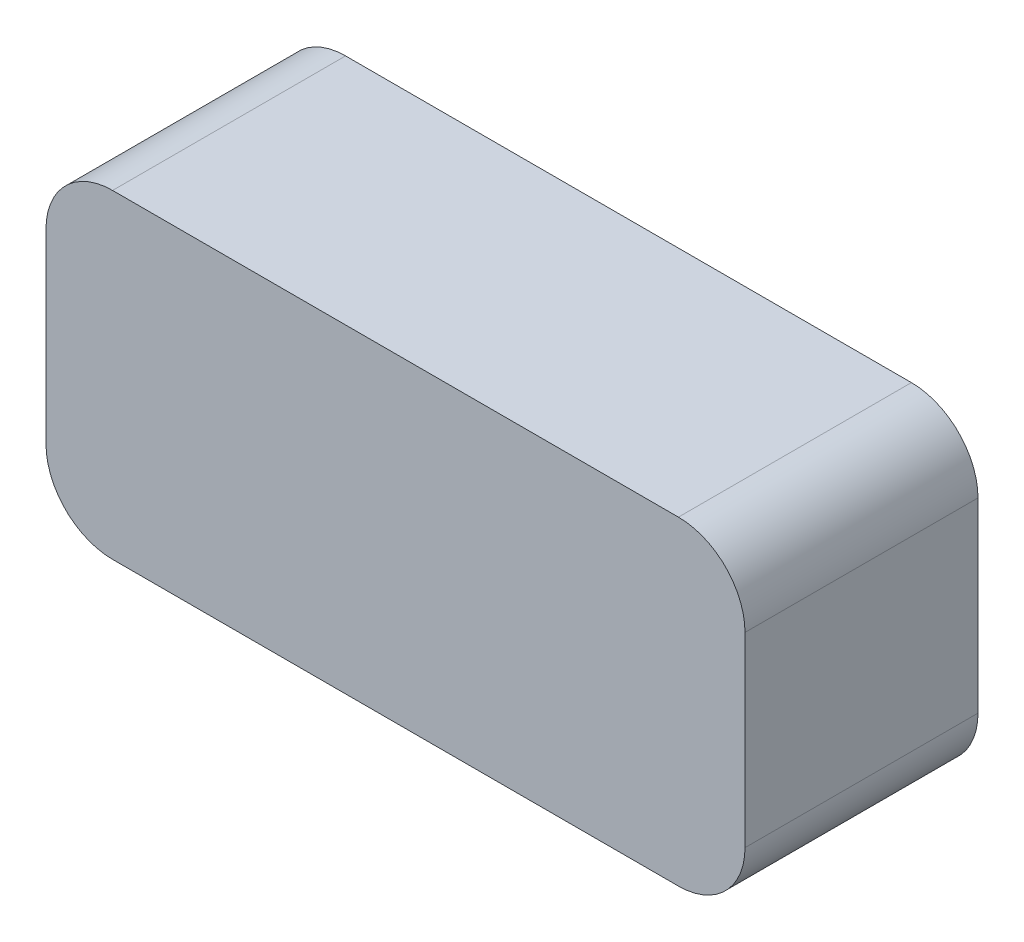
ISO-10303-21;
HEADER;
FILE_DESCRIPTION(('STEP AP214'),'2;1');
FILE_NAME('part.step','',(''),(''),'','','');
FILE_SCHEMA(('AUTOMOTIVE_DESIGN { 1 0 10303 214 1 1 1 1 }'));
ENDSEC;
DATA;
#1=APPLICATION_CONTEXT('core data for automotive mechanical design processes');
#2=APPLICATION_PROTOCOL_DEFINITION('international standard','automotive_design',2000,#1);
#3=PRODUCT_CONTEXT('',#1,'mechanical');
#4=PRODUCT('Part','Part','',(#3));
#5=PRODUCT_RELATED_PRODUCT_CATEGORY('part','',(#4));
#6=PRODUCT_DEFINITION_FORMATION('','',#4);
#7=PRODUCT_DEFINITION_CONTEXT('part definition',#1,'design');
#8=PRODUCT_DEFINITION('design','',#6,#7);
#9=PRODUCT_DEFINITION_SHAPE('','',#8);
#10=(LENGTH_UNIT() NAMED_UNIT(*) SI_UNIT(.MILLI.,.METRE.));
#11=(NAMED_UNIT(*) PLANE_ANGLE_UNIT() SI_UNIT($,.RADIAN.));
#12=(NAMED_UNIT(*) SI_UNIT($,.STERADIAN.) SOLID_ANGLE_UNIT());
#13=UNCERTAINTY_MEASURE_WITH_UNIT(LENGTH_MEASURE(1.E-05),#10,'distance_accuracy_value','');
#14=(GEOMETRIC_REPRESENTATION_CONTEXT(3) GLOBAL_UNCERTAINTY_ASSIGNED_CONTEXT((#13)) GLOBAL_UNIT_ASSIGNED_CONTEXT((#10,
#11,#12)) REPRESENTATION_CONTEXT('',''));
#15=CARTESIAN_POINT('',(0.,0.,0.));
#16=DIRECTION('',(0.,0.,1.));
#17=DIRECTION('',(1.,0.,0.));
#18=AXIS2_PLACEMENT_3D('',#15,#16,#17);
#19=CARTESIAN_POINT('',(-8.5,-3.,7.));
#20=DIRECTION('',(0.,0.,-1.));
#21=DIRECTION('',(-1.,0.,0.));
#22=AXIS2_PLACEMENT_3D('',#19,#20,#21);
#23=CYLINDRICAL_SURFACE('',#22,2.);
#24=CARTESIAN_POINT('',(-8.5,-3.,0.));
#25=DIRECTION('',(0.,0.,1.));
#26=DIRECTION('',(1.,0.,0.));
#27=AXIS2_PLACEMENT_3D('',#24,#25,#26);
#28=CIRCLE('',#27,2.);
#29=CARTESIAN_POINT('',(-10.5,-3.,0.));
#30=VERTEX_POINT('',#29);
#31=CARTESIAN_POINT('',(-8.5,-5.,0.));
#32=VERTEX_POINT('',#31);
#33=EDGE_CURVE('E133',#30,#32,#28,.T.);
#34=ORIENTED_EDGE('',*,*,#33,.T.);
#35=DIRECTION('',(0.,0.,-1.));
#36=VECTOR('',#35,1.);
#37=CARTESIAN_POINT('',(-8.5,-5.,7.));
#38=LINE('',#37,#36);
#39=CARTESIAN_POINT('',(-8.5,-5.,7.));
#40=VERTEX_POINT('',#39);
#41=EDGE_CURVE('E11',#40,#32,#38,.T.);
#42=ORIENTED_EDGE('',*,*,#41,.F.);
#43=CARTESIAN_POINT('',(-8.5,-3.,7.));
#44=DIRECTION('',(0.,0.,1.));
#45=DIRECTION('',(1.,0.,0.));
#46=AXIS2_PLACEMENT_3D('',#43,#44,#45);
#47=CIRCLE('',#46,2.);
#48=CARTESIAN_POINT('',(-10.5,-3.,7.));
#49=VERTEX_POINT('',#48);
#50=EDGE_CURVE('E149',#49,#40,#47,.T.);
#51=ORIENTED_EDGE('',*,*,#50,.F.);
#52=DIRECTION('',(0.,0.,-1.));
#53=VECTOR('',#52,1.);
#54=CARTESIAN_POINT('',(-10.5,-3.,7.));
#55=LINE('',#54,#53);
#56=EDGE_CURVE('E132',#49,#30,#55,.T.);
#57=ORIENTED_EDGE('',*,*,#56,.T.);
#58=EDGE_LOOP('',(#34,#42,#51,#57));
#59=FACE_BOUND('',#58,.T.);
#60=ADVANCED_FACE('F39',(#59),#23,.T.);
#61=CARTESIAN_POINT('',(-8.5,-5.,7.));
#62=DIRECTION('',(0.,1.,0.));
#63=DIRECTION('',(0.,0.,1.));
#64=AXIS2_PLACEMENT_3D('',#61,#62,#63);
#65=PLANE('',#64);
#66=DIRECTION('',(1.,0.,0.));
#67=VECTOR('',#66,1.);
#68=CARTESIAN_POINT('',(-8.5,-5.,0.));
#69=LINE('',#68,#67);
#70=CARTESIAN_POINT('',(8.5,-5.,0.));
#71=VERTEX_POINT('',#70);
#72=EDGE_CURVE('E137',#32,#71,#69,.T.);
#73=ORIENTED_EDGE('',*,*,#72,.T.);
#74=DIRECTION('',(0.,0.,-1.));
#75=VECTOR('',#74,1.);
#76=CARTESIAN_POINT('',(8.5,-5.,7.));
#77=LINE('',#76,#75);
#78=CARTESIAN_POINT('',(8.5,-5.,7.));
#79=VERTEX_POINT('',#78);
#80=EDGE_CURVE('E50',#79,#71,#77,.T.);
#81=ORIENTED_EDGE('',*,*,#80,.F.);
#82=DIRECTION('',(1.,0.,0.));
#83=VECTOR('',#82,1.);
#84=CARTESIAN_POINT('',(-8.5,-5.,7.));
#85=LINE('',#84,#83);
#86=EDGE_CURVE('E98',#40,#79,#85,.T.);
#87=ORIENTED_EDGE('',*,*,#86,.F.);
#88=ORIENTED_EDGE('',*,*,#41,.T.);
#89=EDGE_LOOP('',(#73,#81,#87,#88));
#90=FACE_BOUND('',#89,.T.);
#91=ADVANCED_FACE('F184',(#90),#65,.F.);
#92=CARTESIAN_POINT('',(8.5,-3.,7.));
#93=DIRECTION('',(0.,0.,-1.));
#94=DIRECTION('',(-1.,0.,0.));
#95=AXIS2_PLACEMENT_3D('',#92,#93,#94);
#96=CYLINDRICAL_SURFACE('',#95,2.);
#97=CARTESIAN_POINT('',(8.5,-3.,0.));
#98=DIRECTION('',(0.,0.,1.));
#99=DIRECTION('',(1.,0.,0.));
#100=AXIS2_PLACEMENT_3D('',#97,#98,#99);
#101=CIRCLE('',#100,2.);
#102=CARTESIAN_POINT('',(10.5,-3.,0.));
#103=VERTEX_POINT('',#102);
#104=EDGE_CURVE('E139',#71,#103,#101,.T.);
#105=ORIENTED_EDGE('',*,*,#104,.T.);
#106=DIRECTION('',(0.,0.,-1.));
#107=VECTOR('',#106,1.);
#108=CARTESIAN_POINT('',(10.5,-3.,7.));
#109=LINE('',#108,#107);
#110=CARTESIAN_POINT('',(10.5,-3.,7.));
#111=VERTEX_POINT('',#110);
#112=EDGE_CURVE('E156',#111,#103,#109,.T.);
#113=ORIENTED_EDGE('',*,*,#112,.F.);
#114=CARTESIAN_POINT('',(8.5,-3.,7.));
#115=DIRECTION('',(0.,0.,1.));
#116=DIRECTION('',(1.,0.,0.));
#117=AXIS2_PLACEMENT_3D('',#114,#115,#116);
#118=CIRCLE('',#117,2.);
#119=EDGE_CURVE('E163',#79,#111,#118,.T.);
#120=ORIENTED_EDGE('',*,*,#119,.F.);
#121=ORIENTED_EDGE('',*,*,#80,.T.);
#122=EDGE_LOOP('',(#105,#113,#120,#121));
#123=FACE_BOUND('',#122,.T.);
#124=ADVANCED_FACE('F165',(#123),#96,.T.);
#125=CARTESIAN_POINT('',(10.5,-3.,7.));
#126=DIRECTION('',(-1.,0.,0.));
#127=DIRECTION('',(0.,0.,1.));
#128=AXIS2_PLACEMENT_3D('',#125,#126,#127);
#129=PLANE('',#128);
#130=DIRECTION('',(0.,1.,0.));
#131=VECTOR('',#130,1.);
#132=CARTESIAN_POINT('',(10.5,-3.,0.));
#133=LINE('',#132,#131);
#134=CARTESIAN_POINT('',(10.5,2.6,0.));
#135=VERTEX_POINT('',#134);
#136=EDGE_CURVE('E142',#103,#135,#133,.T.);
#137=ORIENTED_EDGE('',*,*,#136,.T.);
#138=DIRECTION('',(0.,0.,-1.));
#139=VECTOR('',#138,1.);
#140=CARTESIAN_POINT('',(10.5,2.6,7.));
#141=LINE('',#140,#139);
#142=CARTESIAN_POINT('',(10.5,2.6,7.));
#143=VERTEX_POINT('',#142);
#144=EDGE_CURVE('E153',#143,#135,#141,.T.);
#145=ORIENTED_EDGE('',*,*,#144,.F.);
#146=DIRECTION('',(0.,1.,0.));
#147=VECTOR('',#146,1.);
#148=CARTESIAN_POINT('',(10.5,-3.,7.));
#149=LINE('',#148,#147);
#150=EDGE_CURVE('E176',#111,#143,#149,.T.);
#151=ORIENTED_EDGE('',*,*,#150,.F.);
#152=ORIENTED_EDGE('',*,*,#112,.T.);
#153=EDGE_LOOP('',(#137,#145,#151,#152));
#154=FACE_BOUND('',#153,.T.);
#155=ADVANCED_FACE('F175',(#154),#129,.F.);
#156=CARTESIAN_POINT('',(8.5,2.6,7.));
#157=DIRECTION('',(0.,0.,-1.));
#158=DIRECTION('',(-1.,0.,0.));
#159=AXIS2_PLACEMENT_3D('',#156,#157,#158);
#160=CYLINDRICAL_SURFACE('',#159,2.);
#161=CARTESIAN_POINT('',(8.5,2.6,0.));
#162=DIRECTION('',(0.,0.,1.));
#163=DIRECTION('',(1.,0.,0.));
#164=AXIS2_PLACEMENT_3D('',#161,#162,#163);
#165=CIRCLE('',#164,2.);
#166=CARTESIAN_POINT('',(8.5,4.6,0.));
#167=VERTEX_POINT('',#166);
#168=EDGE_CURVE('E145',#135,#167,#165,.T.);
#169=ORIENTED_EDGE('',*,*,#168,.T.);
#170=DIRECTION('',(0.,0.,-1.));
#171=VECTOR('',#170,1.);
#172=CARTESIAN_POINT('',(8.5,4.6,7.));
#173=LINE('',#172,#171);
#174=CARTESIAN_POINT('',(8.5,4.6,7.));
#175=VERTEX_POINT('',#174);
#176=EDGE_CURVE('E127',#175,#167,#173,.T.);
#177=ORIENTED_EDGE('',*,*,#176,.F.);
#178=CARTESIAN_POINT('',(8.5,2.6,7.));
#179=DIRECTION('',(0.,0.,1.));
#180=DIRECTION('',(1.,0.,0.));
#181=AXIS2_PLACEMENT_3D('',#178,#179,#180);
#182=CIRCLE('',#181,2.);
#183=EDGE_CURVE('E120',#143,#175,#182,.T.);
#184=ORIENTED_EDGE('',*,*,#183,.F.);
#185=ORIENTED_EDGE('',*,*,#144,.T.);
#186=EDGE_LOOP('',(#169,#177,#184,#185));
#187=FACE_BOUND('',#186,.T.);
#188=ADVANCED_FACE('F173',(#187),#160,.T.);
#189=CARTESIAN_POINT('',(8.5,4.6,7.));
#190=DIRECTION('',(0.,-1.,0.));
#191=DIRECTION('',(0.,0.,-1.));
#192=AXIS2_PLACEMENT_3D('',#189,#190,#191);
#193=PLANE('',#192);
#194=DIRECTION('',(-1.,0.,0.));
#195=VECTOR('',#194,1.);
#196=CARTESIAN_POINT('',(8.5,4.6,0.));
#197=LINE('',#196,#195);
#198=CARTESIAN_POINT('',(-8.5,4.6,0.));
#199=VERTEX_POINT('',#198);
#200=EDGE_CURVE('E124',#167,#199,#197,.T.);
#201=ORIENTED_EDGE('',*,*,#200,.T.);
#202=DIRECTION('',(0.,0.,-1.));
#203=VECTOR('',#202,1.);
#204=CARTESIAN_POINT('',(-8.5,4.6,7.));
#205=LINE('',#204,#203);
#206=CARTESIAN_POINT('',(-8.5,4.6,7.));
#207=VERTEX_POINT('',#206);
#208=EDGE_CURVE('E125',#207,#199,#205,.T.);
#209=ORIENTED_EDGE('',*,*,#208,.F.);
#210=DIRECTION('',(-1.,0.,0.));
#211=VECTOR('',#210,1.);
#212=CARTESIAN_POINT('',(8.5,4.6,7.));
#213=LINE('',#212,#211);
#214=EDGE_CURVE('E112',#175,#207,#213,.T.);
#215=ORIENTED_EDGE('',*,*,#214,.F.);
#216=ORIENTED_EDGE('',*,*,#176,.T.);
#217=EDGE_LOOP('',(#201,#209,#215,#216));
#218=FACE_BOUND('',#217,.T.);
#219=ADVANCED_FACE('F122',(#218),#193,.F.);
#220=CARTESIAN_POINT('',(-8.5,2.6,7.));
#221=DIRECTION('',(0.,0.,-1.));
#222=DIRECTION('',(-1.,0.,0.));
#223=AXIS2_PLACEMENT_3D('',#220,#221,#222);
#224=CYLINDRICAL_SURFACE('',#223,2.);
#225=CARTESIAN_POINT('',(-8.5,2.6,0.));
#226=DIRECTION('',(0.,0.,1.));
#227=DIRECTION('',(1.,0.,0.));
#228=AXIS2_PLACEMENT_3D('',#225,#226,#227);
#229=CIRCLE('',#228,2.);
#230=CARTESIAN_POINT('',(-10.5,2.6,0.));
#231=VERTEX_POINT('',#230);
#232=EDGE_CURVE('E83',#199,#231,#229,.T.);
#233=ORIENTED_EDGE('',*,*,#232,.T.);
#234=DIRECTION('',(0.,0.,-1.));
#235=VECTOR('',#234,1.);
#236=CARTESIAN_POINT('',(-10.5,2.6,7.));
#237=LINE('',#236,#235);
#238=CARTESIAN_POINT('',(-10.5,2.6,7.));
#239=VERTEX_POINT('',#238);
#240=EDGE_CURVE('E130',#239,#231,#237,.T.);
#241=ORIENTED_EDGE('',*,*,#240,.F.);
#242=CARTESIAN_POINT('',(-8.5,2.6,7.));
#243=DIRECTION('',(0.,0.,1.));
#244=DIRECTION('',(1.,0.,0.));
#245=AXIS2_PLACEMENT_3D('',#242,#243,#244);
#246=CIRCLE('',#245,2.);
#247=EDGE_CURVE('E113',#207,#239,#246,.T.);
#248=ORIENTED_EDGE('',*,*,#247,.F.);
#249=ORIENTED_EDGE('',*,*,#208,.T.);
#250=EDGE_LOOP('',(#233,#241,#248,#249));
#251=FACE_BOUND('',#250,.T.);
#252=ADVANCED_FACE('F129',(#251),#224,.T.);
#253=CARTESIAN_POINT('',(-10.5,2.6,7.));
#254=DIRECTION('',(1.,0.,0.));
#255=DIRECTION('',(0.,0.,-1.));
#256=AXIS2_PLACEMENT_3D('',#253,#254,#255);
#257=PLANE('',#256);
#258=DIRECTION('',(0.,-1.,0.));
#259=VECTOR('',#258,1.);
#260=CARTESIAN_POINT('',(-10.5,2.6,0.));
#261=LINE('',#260,#259);
#262=EDGE_CURVE('E89',#231,#30,#261,.T.);
#263=ORIENTED_EDGE('',*,*,#262,.T.);
#264=ORIENTED_EDGE('',*,*,#56,.F.);
#265=DIRECTION('',(0.,-1.,0.));
#266=VECTOR('',#265,1.);
#267=CARTESIAN_POINT('',(-10.5,2.6,7.));
#268=LINE('',#267,#266);
#269=EDGE_CURVE('E54',#239,#49,#268,.T.);
#270=ORIENTED_EDGE('',*,*,#269,.F.);
#271=ORIENTED_EDGE('',*,*,#240,.T.);
#272=EDGE_LOOP('',(#263,#264,#270,#271));
#273=FACE_BOUND('',#272,.T.);
#274=ADVANCED_FACE('F199',(#273),#257,.F.);
#275=CARTESIAN_POINT('',(-8.5,-3.,7.));
#276=DIRECTION('',(0.,0.,1.));
#277=DIRECTION('',(1.,0.,0.));
#278=AXIS2_PLACEMENT_3D('',#275,#276,#277);
#279=PLANE('',#278);
#280=ORIENTED_EDGE('',*,*,#50,.T.);
#281=ORIENTED_EDGE('',*,*,#86,.T.);
#282=ORIENTED_EDGE('',*,*,#119,.T.);
#283=ORIENTED_EDGE('',*,*,#150,.T.);
#284=ORIENTED_EDGE('',*,*,#183,.T.);
#285=ORIENTED_EDGE('',*,*,#214,.T.);
#286=ORIENTED_EDGE('',*,*,#247,.T.);
#287=ORIENTED_EDGE('',*,*,#269,.T.);
#288=EDGE_LOOP('',(#280,#281,#282,#283,#284,#285,#286,#287));
#289=FACE_BOUND('',#288,.T.);
#290=ADVANCED_FACE('F114',(#289),#279,.T.);
#291=CARTESIAN_POINT('',(-8.5,-3.,0.));
#292=DIRECTION('',(0.,0.,1.));
#293=DIRECTION('',(1.,0.,0.));
#294=AXIS2_PLACEMENT_3D('',#291,#292,#293);
#295=PLANE('',#294);
#296=ORIENTED_EDGE('',*,*,#33,.F.);
#297=ORIENTED_EDGE('',*,*,#262,.F.);
#298=ORIENTED_EDGE('',*,*,#232,.F.);
#299=ORIENTED_EDGE('',*,*,#200,.F.);
#300=ORIENTED_EDGE('',*,*,#168,.F.);
#301=ORIENTED_EDGE('',*,*,#136,.F.);
#302=ORIENTED_EDGE('',*,*,#104,.F.);
#303=ORIENTED_EDGE('',*,*,#72,.F.);
#304=EDGE_LOOP('',(#296,#297,#298,#299,#300,#301,#302,#303));
#305=FACE_BOUND('',#304,.T.);
#306=ADVANCED_FACE('F169',(#305),#295,.F.);
#307=CLOSED_SHELL('',(#60,#91,#124,#155,#188,#219,#252,#274,#290,#306));
#308=MANIFOLD_SOLID_BREP('B2',#307);
#309=ADVANCED_BREP_SHAPE_REPRESENTATION('',(#18,#308),#14);
#310=SHAPE_DEFINITION_REPRESENTATION(#9,#309);
ENDSEC;
END-ISO-10303-21;
